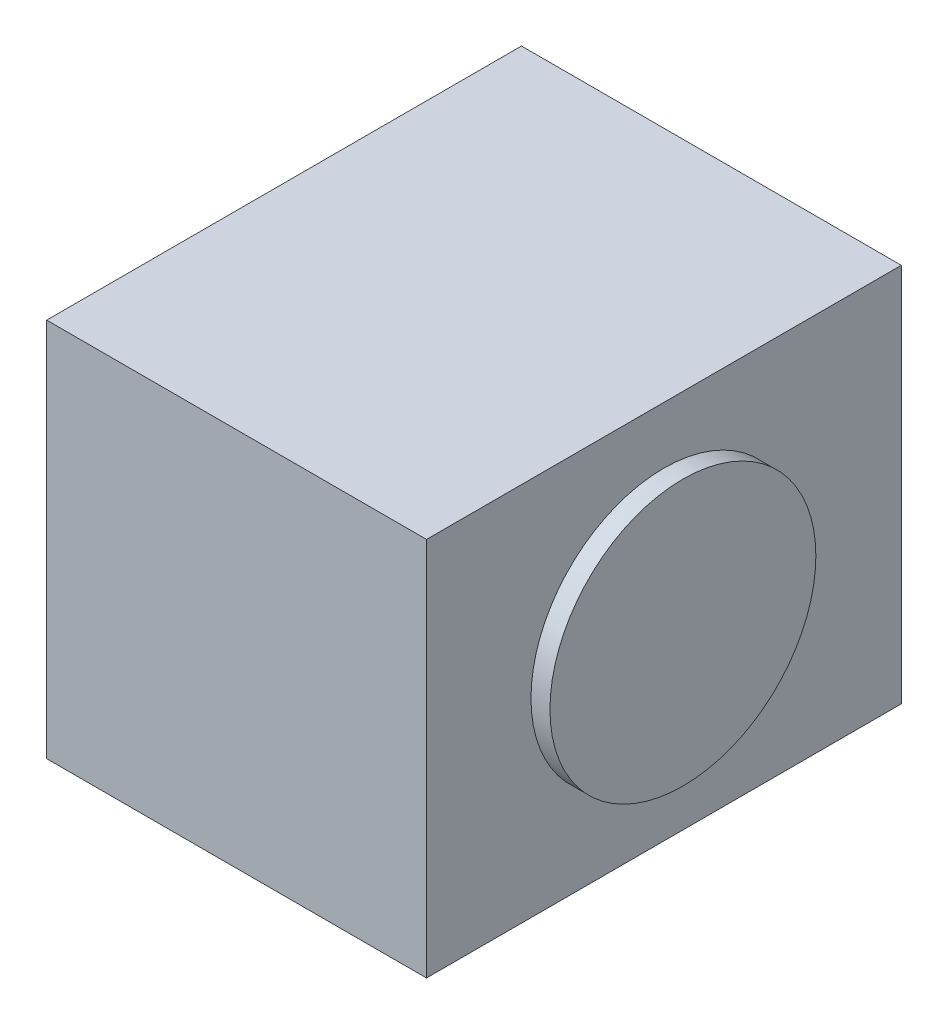
ISO-10303-21;
HEADER;
FILE_DESCRIPTION(('STEP AP214'),'2;1');
FILE_NAME('part.step','',(''),(''),'','','');
FILE_SCHEMA(('AUTOMOTIVE_DESIGN { 1 0 10303 214 1 1 1 1 }'));
ENDSEC;
DATA;
#1=APPLICATION_CONTEXT('core data for automotive mechanical design processes');
#2=APPLICATION_PROTOCOL_DEFINITION('international standard','automotive_design',2000,#1);
#3=PRODUCT_CONTEXT('',#1,'mechanical');
#4=PRODUCT('Part','Part','',(#3));
#5=PRODUCT_RELATED_PRODUCT_CATEGORY('part','',(#4));
#6=PRODUCT_DEFINITION_FORMATION('','',#4);
#7=PRODUCT_DEFINITION_CONTEXT('part definition',#1,'design');
#8=PRODUCT_DEFINITION('design','',#6,#7);
#9=PRODUCT_DEFINITION_SHAPE('','',#8);
#10=(LENGTH_UNIT() NAMED_UNIT(*) SI_UNIT(.MILLI.,.METRE.));
#11=(NAMED_UNIT(*) PLANE_ANGLE_UNIT() SI_UNIT($,.RADIAN.));
#12=(NAMED_UNIT(*) SI_UNIT($,.STERADIAN.) SOLID_ANGLE_UNIT());
#13=UNCERTAINTY_MEASURE_WITH_UNIT(LENGTH_MEASURE(1.E-05),#10,'distance_accuracy_value','');
#14=(GEOMETRIC_REPRESENTATION_CONTEXT(3) GLOBAL_UNCERTAINTY_ASSIGNED_CONTEXT((#13)) GLOBAL_UNIT_ASSIGNED_CONTEXT((#10,
#11,#12)) REPRESENTATION_CONTEXT('',''));
#15=CARTESIAN_POINT('',(0.,0.,0.));
#16=DIRECTION('',(0.,0.,1.));
#17=DIRECTION('',(1.,0.,0.));
#18=AXIS2_PLACEMENT_3D('',#15,#16,#17);
#19=CARTESIAN_POINT('',(0.,0.,250.));
#20=DIRECTION('',(-1.,0.,0.));
#21=DIRECTION('',(0.,-1.,0.));
#22=AXIS2_PLACEMENT_3D('',#19,#20,#21);
#23=PLANE('',#22);
#24=CARTESIAN_POINT('',(0.,-100.,125.));
#25=DIRECTION('',(1.,0.,0.));
#26=DIRECTION('',(0.,1.,0.));
#27=AXIS2_PLACEMENT_3D('',#24,#25,#26);
#28=CIRCLE('',#27,70.);
#29=CARTESIAN_POINT('',(0.,-30.,125.));
#30=VERTEX_POINT('',#29);
#31=EDGE_CURVE('E11',#30,#30,#28,.T.);
#32=ORIENTED_EDGE('',*,*,#31,.F.);
#33=EDGE_LOOP('',(#32));
#34=FACE_BOUND('',#33,.T.);
#35=DIRECTION('',(0.,1.,0.));
#36=VECTOR('',#35,1.);
#37=CARTESIAN_POINT('',(0.,0.,0.));
#38=LINE('',#37,#36);
#39=CARTESIAN_POINT('',(0.,-200.,0.));
#40=VERTEX_POINT('',#39);
#41=CARTESIAN_POINT('',(0.,0.,0.));
#42=VERTEX_POINT('',#41);
#43=EDGE_CURVE('E104',#40,#42,#38,.T.);
#44=ORIENTED_EDGE('',*,*,#43,.T.);
#45=DIRECTION('',(0.,0.,-1.));
#46=VECTOR('',#45,1.);
#47=CARTESIAN_POINT('',(0.,0.,250.));
#48=LINE('',#47,#46);
#49=CARTESIAN_POINT('',(0.,0.,250.));
#50=VERTEX_POINT('',#49);
#51=EDGE_CURVE('E45',#50,#42,#48,.T.);
#52=ORIENTED_EDGE('',*,*,#51,.F.);
#53=DIRECTION('',(0.,1.,0.));
#54=VECTOR('',#53,1.);
#55=CARTESIAN_POINT('',(0.,0.,250.));
#56=LINE('',#55,#54);
#57=CARTESIAN_POINT('',(0.,-200.,250.));
#58=VERTEX_POINT('',#57);
#59=EDGE_CURVE('E95',#58,#50,#56,.T.);
#60=ORIENTED_EDGE('',*,*,#59,.F.);
#61=DIRECTION('',(0.,0.,-1.));
#62=VECTOR('',#61,1.);
#63=CARTESIAN_POINT('',(0.,-200.,250.));
#64=LINE('',#63,#62);
#65=EDGE_CURVE('E101',#58,#40,#64,.T.);
#66=ORIENTED_EDGE('',*,*,#65,.T.);
#67=EDGE_LOOP('',(#44,#52,#60,#66));
#68=FACE_BOUND('',#67,.T.);
#69=ADVANCED_FACE('F39',(#34,#68),#23,.F.);
#70=CARTESIAN_POINT('',(0.,0.,250.));
#71=DIRECTION('',(0.,-1.,0.));
#72=DIRECTION('',(0.,0.,-1.));
#73=AXIS2_PLACEMENT_3D('',#70,#71,#72);
#74=PLANE('',#73);
#75=DIRECTION('',(-1.,0.,0.));
#76=VECTOR('',#75,1.);
#77=CARTESIAN_POINT('',(0.,0.,0.));
#78=LINE('',#77,#76);
#79=CARTESIAN_POINT('',(-200.,0.,0.));
#80=VERTEX_POINT('',#79);
#81=EDGE_CURVE('E100',#42,#80,#78,.T.);
#82=ORIENTED_EDGE('',*,*,#81,.T.);
#83=DIRECTION('',(0.,0.,-1.));
#84=VECTOR('',#83,1.);
#85=CARTESIAN_POINT('',(-200.,0.,250.));
#86=LINE('',#85,#84);
#87=CARTESIAN_POINT('',(-200.,0.,250.));
#88=VERTEX_POINT('',#87);
#89=EDGE_CURVE('E92',#88,#80,#86,.T.);
#90=ORIENTED_EDGE('',*,*,#89,.F.);
#91=DIRECTION('',(-1.,0.,0.));
#92=VECTOR('',#91,1.);
#93=CARTESIAN_POINT('',(0.,0.,250.));
#94=LINE('',#93,#92);
#95=EDGE_CURVE('E87',#50,#88,#94,.T.);
#96=ORIENTED_EDGE('',*,*,#95,.F.);
#97=ORIENTED_EDGE('',*,*,#51,.T.);
#98=EDGE_LOOP('',(#82,#90,#96,#97));
#99=FACE_BOUND('',#98,.T.);
#100=ADVANCED_FACE('F96',(#99),#74,.F.);
#101=CARTESIAN_POINT('',(-200.,0.,250.));
#102=DIRECTION('',(1.,0.,0.));
#103=DIRECTION('',(0.,1.,0.));
#104=AXIS2_PLACEMENT_3D('',#101,#102,#103);
#105=PLANE('',#104);
#106=DIRECTION('',(0.,-1.,0.));
#107=VECTOR('',#106,1.);
#108=CARTESIAN_POINT('',(-200.,0.,0.));
#109=LINE('',#108,#107);
#110=CARTESIAN_POINT('',(-200.,-200.,0.));
#111=VERTEX_POINT('',#110);
#112=EDGE_CURVE('E71',#80,#111,#109,.T.);
#113=ORIENTED_EDGE('',*,*,#112,.T.);
#114=DIRECTION('',(0.,0.,-1.));
#115=VECTOR('',#114,1.);
#116=CARTESIAN_POINT('',(-200.,-200.,250.));
#117=LINE('',#116,#115);
#118=CARTESIAN_POINT('',(-200.,-200.,250.));
#119=VERTEX_POINT('',#118);
#120=EDGE_CURVE('E98',#119,#111,#117,.T.);
#121=ORIENTED_EDGE('',*,*,#120,.F.);
#122=DIRECTION('',(0.,-1.,0.));
#123=VECTOR('',#122,1.);
#124=CARTESIAN_POINT('',(-200.,0.,250.));
#125=LINE('',#124,#123);
#126=EDGE_CURVE('E89',#88,#119,#125,.T.);
#127=ORIENTED_EDGE('',*,*,#126,.F.);
#128=ORIENTED_EDGE('',*,*,#89,.T.);
#129=EDGE_LOOP('',(#113,#121,#127,#128));
#130=FACE_BOUND('',#129,.T.);
#131=ADVANCED_FACE('F97',(#130),#105,.F.);
#132=CARTESIAN_POINT('',(0.,-200.,250.));
#133=DIRECTION('',(0.,1.,0.));
#134=DIRECTION('',(-1.,0.,0.));
#135=AXIS2_PLACEMENT_3D('',#132,#133,#134);
#136=PLANE('',#135);
#137=DIRECTION('',(1.,0.,0.));
#138=VECTOR('',#137,1.);
#139=CARTESIAN_POINT('',(0.,-200.,0.));
#140=LINE('',#139,#138);
#141=EDGE_CURVE('E76',#111,#40,#140,.T.);
#142=ORIENTED_EDGE('',*,*,#141,.T.);
#143=ORIENTED_EDGE('',*,*,#65,.F.);
#144=DIRECTION('',(1.,0.,0.));
#145=VECTOR('',#144,1.);
#146=CARTESIAN_POINT('',(0.,-200.,250.));
#147=LINE('',#146,#145);
#148=EDGE_CURVE('E57',#119,#58,#147,.T.);
#149=ORIENTED_EDGE('',*,*,#148,.F.);
#150=ORIENTED_EDGE('',*,*,#120,.T.);
#151=EDGE_LOOP('',(#142,#143,#149,#150));
#152=FACE_BOUND('',#151,.T.);
#153=ADVANCED_FACE('F114',(#152),#136,.F.);
#154=CARTESIAN_POINT('',(0.,0.,250.));
#155=DIRECTION('',(0.,0.,-1.));
#156=DIRECTION('',(-1.,0.,0.));
#157=AXIS2_PLACEMENT_3D('',#154,#155,#156);
#158=PLANE('',#157);
#159=ORIENTED_EDGE('',*,*,#59,.T.);
#160=ORIENTED_EDGE('',*,*,#95,.T.);
#161=ORIENTED_EDGE('',*,*,#126,.T.);
#162=ORIENTED_EDGE('',*,*,#148,.T.);
#163=EDGE_LOOP('',(#159,#160,#161,#162));
#164=FACE_BOUND('',#163,.T.);
#165=ADVANCED_FACE('F86',(#164),#158,.F.);
#166=CARTESIAN_POINT('',(0.,0.,0.));
#167=DIRECTION('',(0.,0.,-1.));
#168=DIRECTION('',(-1.,0.,0.));
#169=AXIS2_PLACEMENT_3D('',#166,#167,#168);
#170=PLANE('',#169);
#171=CARTESIAN_POINT('',(-100.,-100.,0.));
#172=DIRECTION('',(0.,0.,-1.));
#173=DIRECTION('',(-1.,0.,0.));
#174=AXIS2_PLACEMENT_3D('',#171,#172,#173);
#175=CIRCLE('',#174,70.);
#176=CARTESIAN_POINT('',(-170.,-100.,0.));
#177=VERTEX_POINT('',#176);
#178=EDGE_CURVE('E116',#177,#177,#175,.T.);
#179=ORIENTED_EDGE('',*,*,#178,.F.);
#180=EDGE_LOOP('',(#179));
#181=FACE_BOUND('',#180,.T.);
#182=ORIENTED_EDGE('',*,*,#43,.F.);
#183=ORIENTED_EDGE('',*,*,#141,.F.);
#184=ORIENTED_EDGE('',*,*,#112,.F.);
#185=ORIENTED_EDGE('',*,*,#81,.F.);
#186=EDGE_LOOP('',(#182,#183,#184,#185));
#187=FACE_BOUND('',#186,.T.);
#188=ADVANCED_FACE('F117',(#181,#187),#170,.T.);
#189=CARTESIAN_POINT('',(-100.,-100.,10.));
#190=DIRECTION('',(0.,0.,-1.));
#191=DIRECTION('',(-1.,0.,0.));
#192=AXIS2_PLACEMENT_3D('',#189,#190,#191);
#193=CYLINDRICAL_SURFACE('',#192,70.);
#194=CARTESIAN_POINT('',(-100.,-100.,10.));
#195=DIRECTION('',(0.,0.,-1.));
#196=DIRECTION('',(-1.,0.,0.));
#197=AXIS2_PLACEMENT_3D('',#194,#195,#196);
#198=CIRCLE('',#197,70.);
#199=CARTESIAN_POINT('',(-170.,-100.,10.));
#200=VERTEX_POINT('',#199);
#201=EDGE_CURVE('E107',#200,#200,#198,.T.);
#202=ORIENTED_EDGE('',*,*,#201,.F.);
#203=EDGE_LOOP('',(#202));
#204=FACE_BOUND('',#203,.T.);
#205=ORIENTED_EDGE('',*,*,#178,.T.);
#206=EDGE_LOOP('',(#205));
#207=FACE_BOUND('',#206,.T.);
#208=ADVANCED_FACE('F151',(#204,#207),#193,.F.);
#209=CARTESIAN_POINT('',(-100.,-100.,10.));
#210=DIRECTION('',(0.,0.,-1.));
#211=DIRECTION('',(-1.,0.,0.));
#212=AXIS2_PLACEMENT_3D('',#209,#210,#211);
#213=PLANE('',#212);
#214=ORIENTED_EDGE('',*,*,#201,.T.);
#215=EDGE_LOOP('',(#214));
#216=FACE_BOUND('',#215,.T.);
#217=ADVANCED_FACE('F134',(#216),#213,.T.);
#218=CARTESIAN_POINT('',(10.,-100.,125.));
#219=DIRECTION('',(-1.,0.,0.));
#220=DIRECTION('',(0.,-1.,0.));
#221=AXIS2_PLACEMENT_3D('',#218,#219,#220);
#222=CYLINDRICAL_SURFACE('',#221,70.);
#223=CARTESIAN_POINT('',(10.,-100.,125.));
#224=DIRECTION('',(1.,0.,0.));
#225=DIRECTION('',(0.,1.,0.));
#226=AXIS2_PLACEMENT_3D('',#223,#224,#225);
#227=CIRCLE('',#226,70.);
#228=CARTESIAN_POINT('',(10.,-30.,125.));
#229=VERTEX_POINT('',#228);
#230=EDGE_CURVE('E125',#229,#229,#227,.T.);
#231=ORIENTED_EDGE('',*,*,#230,.F.);
#232=EDGE_LOOP('',(#231));
#233=FACE_BOUND('',#232,.T.);
#234=ORIENTED_EDGE('',*,*,#31,.T.);
#235=EDGE_LOOP('',(#234));
#236=FACE_BOUND('',#235,.T.);
#237=ADVANCED_FACE('F128',(#233,#236),#222,.T.);
#238=CARTESIAN_POINT('',(10.,-100.,125.));
#239=DIRECTION('',(1.,0.,0.));
#240=DIRECTION('',(0.,1.,0.));
#241=AXIS2_PLACEMENT_3D('',#238,#239,#240);
#242=PLANE('',#241);
#243=ORIENTED_EDGE('',*,*,#230,.T.);
#244=EDGE_LOOP('',(#243));
#245=FACE_BOUND('',#244,.T.);
#246=ADVANCED_FACE('F126',(#245),#242,.T.);
#247=CLOSED_SHELL('',(#69,#100,#131,#153,#165,#188,#208,#217,#237,#246));
#248=MANIFOLD_SOLID_BREP('B2',#247);
#249=ADVANCED_BREP_SHAPE_REPRESENTATION('',(#18,#248),#14);
#250=SHAPE_DEFINITION_REPRESENTATION(#9,#249);
ENDSEC;
END-ISO-10303-21;
